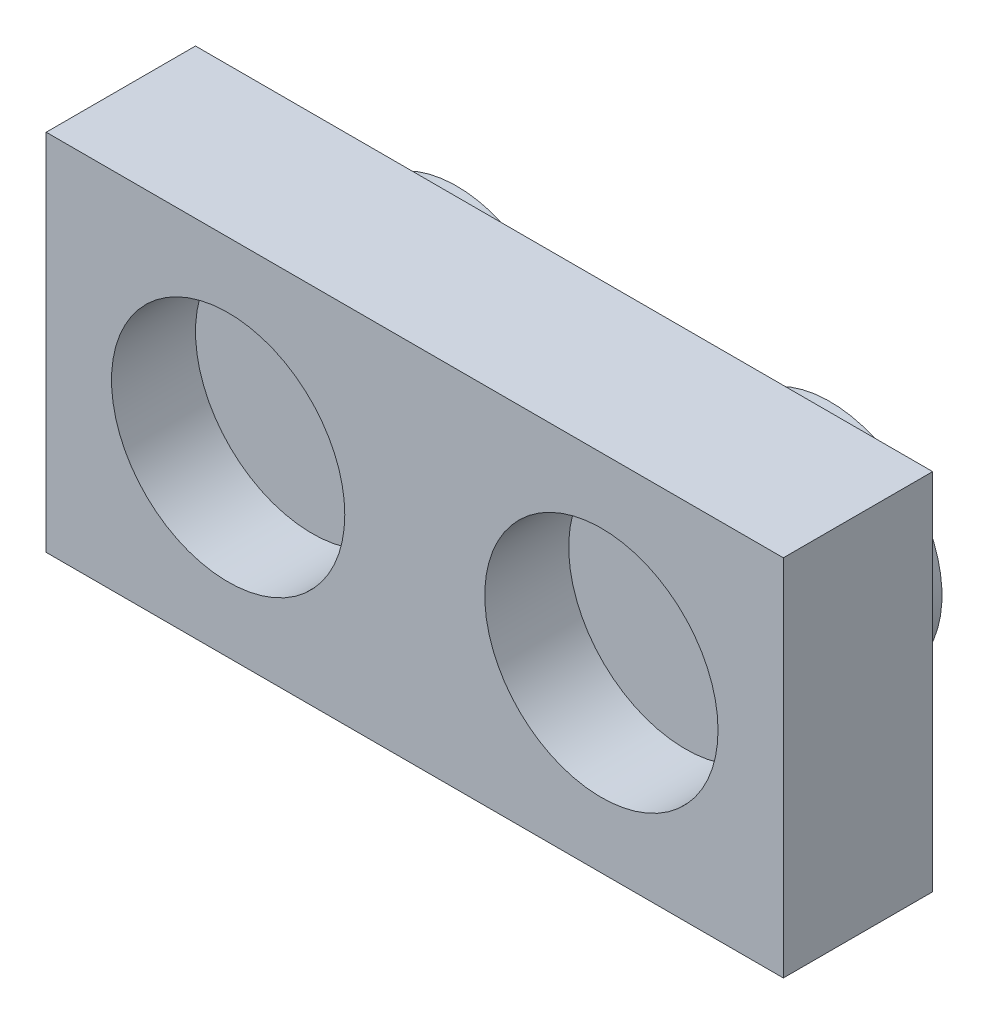
ISO-10303-21;
HEADER;
FILE_DESCRIPTION(('STEP AP214'),'2;1');
FILE_NAME('part.step','',(''),(''),'','','');
FILE_SCHEMA(('AUTOMOTIVE_DESIGN { 1 0 10303 214 1 1 1 1 }'));
ENDSEC;
DATA;
#1=APPLICATION_CONTEXT('core data for automotive mechanical design processes');
#2=APPLICATION_PROTOCOL_DEFINITION('international standard','automotive_design',2000,#1);
#3=PRODUCT_CONTEXT('',#1,'mechanical');
#4=PRODUCT('Part','Part','',(#3));
#5=PRODUCT_RELATED_PRODUCT_CATEGORY('part','',(#4));
#6=PRODUCT_DEFINITION_FORMATION('','',#4);
#7=PRODUCT_DEFINITION_CONTEXT('part definition',#1,'design');
#8=PRODUCT_DEFINITION('design','',#6,#7);
#9=PRODUCT_DEFINITION_SHAPE('','',#8);
#10=(LENGTH_UNIT() NAMED_UNIT(*) SI_UNIT(.MILLI.,.METRE.));
#11=(NAMED_UNIT(*) PLANE_ANGLE_UNIT() SI_UNIT($,.RADIAN.));
#12=(NAMED_UNIT(*) SI_UNIT($,.STERADIAN.) SOLID_ANGLE_UNIT());
#13=UNCERTAINTY_MEASURE_WITH_UNIT(LENGTH_MEASURE(1.E-05),#10,'distance_accuracy_value','');
#14=(GEOMETRIC_REPRESENTATION_CONTEXT(3) GLOBAL_UNCERTAINTY_ASSIGNED_CONTEXT((#13)) GLOBAL_UNIT_ASSIGNED_CONTEXT((#10,
#11,#12)) REPRESENTATION_CONTEXT('',''));
#15=CARTESIAN_POINT('',(0.,0.,0.));
#16=DIRECTION('',(0.,0.,1.));
#17=DIRECTION('',(1.,0.,0.));
#18=AXIS2_PLACEMENT_3D('',#15,#16,#17);
#19=CARTESIAN_POINT('',(7.9,-3.9,3.2));
#20=DIRECTION('',(-1.,0.,0.));
#21=DIRECTION('',(0.,0.,1.));
#22=AXIS2_PLACEMENT_3D('',#19,#20,#21);
#23=PLANE('',#22);
#24=DIRECTION('',(0.,1.,0.));
#25=VECTOR('',#24,1.);
#26=CARTESIAN_POINT('',(7.9,-3.9,0.));
#27=LINE('',#26,#25);
#28=CARTESIAN_POINT('',(7.9,-3.9,0.));
#29=VERTEX_POINT('',#28);
#30=CARTESIAN_POINT('',(7.9,3.9,0.));
#31=VERTEX_POINT('',#30);
#32=EDGE_CURVE('E98',#29,#31,#27,.T.);
#33=ORIENTED_EDGE('',*,*,#32,.T.);
#34=DIRECTION('',(0.,0.,-1.));
#35=VECTOR('',#34,1.);
#36=CARTESIAN_POINT('',(7.9,3.9,3.2));
#37=LINE('',#36,#35);
#38=CARTESIAN_POINT('',(7.9,3.9,3.2));
#39=VERTEX_POINT('',#38);
#40=EDGE_CURVE('E11',#39,#31,#37,.T.);
#41=ORIENTED_EDGE('',*,*,#40,.F.);
#42=DIRECTION('',(0.,1.,0.));
#43=VECTOR('',#42,1.);
#44=CARTESIAN_POINT('',(7.9,-3.9,3.2));
#45=LINE('',#44,#43);
#46=CARTESIAN_POINT('',(7.9,-3.9,3.2));
#47=VERTEX_POINT('',#46);
#48=EDGE_CURVE('E86',#47,#39,#45,.T.);
#49=ORIENTED_EDGE('',*,*,#48,.F.);
#50=DIRECTION('',(0.,0.,-1.));
#51=VECTOR('',#50,1.);
#52=CARTESIAN_POINT('',(7.9,-3.9,3.2));
#53=LINE('',#52,#51);
#54=EDGE_CURVE('E94',#47,#29,#53,.T.);
#55=ORIENTED_EDGE('',*,*,#54,.T.);
#56=EDGE_LOOP('',(#33,#41,#49,#55));
#57=FACE_BOUND('',#56,.T.);
#58=ADVANCED_FACE('F35',(#57),#23,.F.);
#59=CARTESIAN_POINT('',(-7.9,3.9,3.2));
#60=DIRECTION('',(0.,-1.,0.));
#61=DIRECTION('',(0.,0.,-1.));
#62=AXIS2_PLACEMENT_3D('',#59,#60,#61);
#63=PLANE('',#62);
#64=DIRECTION('',(-1.,0.,0.));
#65=VECTOR('',#64,1.);
#66=CARTESIAN_POINT('',(-7.9,3.9,0.));
#67=LINE('',#66,#65);
#68=CARTESIAN_POINT('',(-7.9,3.9,0.));
#69=VERTEX_POINT('',#68);
#70=EDGE_CURVE('E90',#31,#69,#67,.T.);
#71=ORIENTED_EDGE('',*,*,#70,.T.);
#72=DIRECTION('',(0.,0.,-1.));
#73=VECTOR('',#72,1.);
#74=CARTESIAN_POINT('',(-7.9,3.9,3.2));
#75=LINE('',#74,#73);
#76=CARTESIAN_POINT('',(-7.9,3.9,3.2));
#77=VERTEX_POINT('',#76);
#78=EDGE_CURVE('E43',#77,#69,#75,.T.);
#79=ORIENTED_EDGE('',*,*,#78,.F.);
#80=DIRECTION('',(-1.,0.,0.));
#81=VECTOR('',#80,1.);
#82=CARTESIAN_POINT('',(-7.9,3.9,3.2));
#83=LINE('',#82,#81);
#84=EDGE_CURVE('E81',#39,#77,#83,.T.);
#85=ORIENTED_EDGE('',*,*,#84,.F.);
#86=ORIENTED_EDGE('',*,*,#40,.T.);
#87=EDGE_LOOP('',(#71,#79,#85,#86));
#88=FACE_BOUND('',#87,.T.);
#89=ADVANCED_FACE('F89',(#88),#63,.F.);
#90=CARTESIAN_POINT('',(-7.9,-3.9,3.2));
#91=DIRECTION('',(1.,0.,0.));
#92=DIRECTION('',(0.,0.,-1.));
#93=AXIS2_PLACEMENT_3D('',#90,#91,#92);
#94=PLANE('',#93);
#95=DIRECTION('',(0.,-1.,0.));
#96=VECTOR('',#95,1.);
#97=CARTESIAN_POINT('',(-7.9,-3.9,0.));
#98=LINE('',#97,#96);
#99=CARTESIAN_POINT('',(-7.9,-3.9,0.));
#100=VERTEX_POINT('',#99);
#101=EDGE_CURVE('E68',#69,#100,#98,.T.);
#102=ORIENTED_EDGE('',*,*,#101,.T.);
#103=DIRECTION('',(0.,0.,-1.));
#104=VECTOR('',#103,1.);
#105=CARTESIAN_POINT('',(-7.9,-3.9,3.2));
#106=LINE('',#105,#104);
#107=CARTESIAN_POINT('',(-7.9,-3.9,3.2));
#108=VERTEX_POINT('',#107);
#109=EDGE_CURVE('E91',#108,#100,#106,.T.);
#110=ORIENTED_EDGE('',*,*,#109,.F.);
#111=DIRECTION('',(0.,-1.,0.));
#112=VECTOR('',#111,1.);
#113=CARTESIAN_POINT('',(-7.9,-3.9,3.2));
#114=LINE('',#113,#112);
#115=EDGE_CURVE('E84',#77,#108,#114,.T.);
#116=ORIENTED_EDGE('',*,*,#115,.F.);
#117=ORIENTED_EDGE('',*,*,#78,.T.);
#118=EDGE_LOOP('',(#102,#110,#116,#117));
#119=FACE_BOUND('',#118,.T.);
#120=ADVANCED_FACE('F92',(#119),#94,.F.);
#121=CARTESIAN_POINT('',(-7.9,-3.9,3.2));
#122=DIRECTION('',(0.,1.,0.));
#123=DIRECTION('',(0.,0.,1.));
#124=AXIS2_PLACEMENT_3D('',#121,#122,#123);
#125=PLANE('',#124);
#126=DIRECTION('',(1.,0.,0.));
#127=VECTOR('',#126,1.);
#128=CARTESIAN_POINT('',(-7.9,-3.9,0.));
#129=LINE('',#128,#127);
#130=EDGE_CURVE('E74',#100,#29,#129,.T.);
#131=ORIENTED_EDGE('',*,*,#130,.T.);
#132=ORIENTED_EDGE('',*,*,#54,.F.);
#133=DIRECTION('',(1.,0.,0.));
#134=VECTOR('',#133,1.);
#135=CARTESIAN_POINT('',(-7.9,-3.9,3.2));
#136=LINE('',#135,#134);
#137=EDGE_CURVE('E51',#108,#47,#136,.T.);
#138=ORIENTED_EDGE('',*,*,#137,.F.);
#139=ORIENTED_EDGE('',*,*,#109,.T.);
#140=EDGE_LOOP('',(#131,#132,#138,#139));
#141=FACE_BOUND('',#140,.T.);
#142=ADVANCED_FACE('F106',(#141),#125,.F.);
#143=CARTESIAN_POINT('',(0.,0.,3.2));
#144=DIRECTION('',(0.,0.,-1.));
#145=DIRECTION('',(-1.,0.,0.));
#146=AXIS2_PLACEMENT_3D('',#143,#144,#145);
#147=PLANE('',#146);
#148=CARTESIAN_POINT('',(-4.,0.,3.2));
#149=DIRECTION('',(0.,0.,1.));
#150=DIRECTION('',(1.,0.,0.));
#151=AXIS2_PLACEMENT_3D('',#148,#149,#150);
#152=CIRCLE('',#151,2.5);
#153=CARTESIAN_POINT('',(-1.5,0.,3.2));
#154=VERTEX_POINT('',#153);
#155=EDGE_CURVE('E130',#154,#154,#152,.T.);
#156=ORIENTED_EDGE('',*,*,#155,.F.);
#157=EDGE_LOOP('',(#156));
#158=FACE_BOUND('',#157,.T.);
#159=CARTESIAN_POINT('',(4.,0.,3.2));
#160=DIRECTION('',(0.,0.,1.));
#161=DIRECTION('',(1.,0.,0.));
#162=AXIS2_PLACEMENT_3D('',#159,#160,#161);
#163=CIRCLE('',#162,2.5);
#164=CARTESIAN_POINT('',(6.5,0.,3.2));
#165=VERTEX_POINT('',#164);
#166=EDGE_CURVE('E124',#165,#165,#163,.T.);
#167=ORIENTED_EDGE('',*,*,#166,.F.);
#168=EDGE_LOOP('',(#167));
#169=FACE_BOUND('',#168,.T.);
#170=ORIENTED_EDGE('',*,*,#48,.T.);
#171=ORIENTED_EDGE('',*,*,#84,.T.);
#172=ORIENTED_EDGE('',*,*,#115,.T.);
#173=ORIENTED_EDGE('',*,*,#137,.T.);
#174=EDGE_LOOP('',(#170,#171,#172,#173));
#175=FACE_BOUND('',#174,.T.);
#176=ADVANCED_FACE('F82',(#158,#169,#175),#147,.F.);
#177=CARTESIAN_POINT('',(0.,0.,0.));
#178=DIRECTION('',(0.,0.,-1.));
#179=DIRECTION('',(-1.,0.,0.));
#180=AXIS2_PLACEMENT_3D('',#177,#178,#179);
#181=PLANE('',#180);
#182=CARTESIAN_POINT('',(-4.,0.,0.));
#183=DIRECTION('',(0.,0.,-1.));
#184=DIRECTION('',(-1.,0.,0.));
#185=AXIS2_PLACEMENT_3D('',#182,#183,#184);
#186=CIRCLE('',#185,2.4);
#187=CARTESIAN_POINT('',(-6.4,0.,0.));
#188=VERTEX_POINT('',#187);
#189=EDGE_CURVE('E118',#188,#188,#186,.T.);
#190=ORIENTED_EDGE('',*,*,#189,.F.);
#191=EDGE_LOOP('',(#190));
#192=FACE_BOUND('',#191,.T.);
#193=CARTESIAN_POINT('',(4.,0.,0.));
#194=DIRECTION('',(0.,0.,-1.));
#195=DIRECTION('',(-1.,0.,0.));
#196=AXIS2_PLACEMENT_3D('',#193,#194,#195);
#197=CIRCLE('',#196,2.4);
#198=CARTESIAN_POINT('',(1.6,0.,0.));
#199=VERTEX_POINT('',#198);
#200=EDGE_CURVE('E112',#199,#199,#197,.T.);
#201=ORIENTED_EDGE('',*,*,#200,.F.);
#202=EDGE_LOOP('',(#201));
#203=FACE_BOUND('',#202,.T.);
#204=ORIENTED_EDGE('',*,*,#32,.F.);
#205=ORIENTED_EDGE('',*,*,#130,.F.);
#206=ORIENTED_EDGE('',*,*,#101,.F.);
#207=ORIENTED_EDGE('',*,*,#70,.F.);
#208=EDGE_LOOP('',(#204,#205,#206,#207));
#209=FACE_BOUND('',#208,.T.);
#210=ADVANCED_FACE('F109',(#192,#203,#209),#181,.T.);
#211=CARTESIAN_POINT('',(4.,0.,-1.7));
#212=DIRECTION('',(0.,0.,1.));
#213=DIRECTION('',(1.,0.,0.));
#214=AXIS2_PLACEMENT_3D('',#211,#212,#213);
#215=CYLINDRICAL_SURFACE('',#214,2.4);
#216=CARTESIAN_POINT('',(4.,0.,-1.7));
#217=DIRECTION('',(0.,0.,-1.));
#218=DIRECTION('',(-1.,0.,0.));
#219=AXIS2_PLACEMENT_3D('',#216,#217,#218);
#220=CIRCLE('',#219,2.4);
#221=CARTESIAN_POINT('',(1.6,0.,-1.7));
#222=VERTEX_POINT('',#221);
#223=EDGE_CURVE('E101',#222,#222,#220,.T.);
#224=ORIENTED_EDGE('',*,*,#223,.F.);
#225=EDGE_LOOP('',(#224));
#226=FACE_BOUND('',#225,.T.);
#227=ORIENTED_EDGE('',*,*,#200,.T.);
#228=EDGE_LOOP('',(#227));
#229=FACE_BOUND('',#228,.T.);
#230=ADVANCED_FACE('F177',(#226,#229),#215,.T.);
#231=CARTESIAN_POINT('',(4.,0.,-1.7));
#232=DIRECTION('',(0.,0.,-1.));
#233=DIRECTION('',(-1.,0.,0.));
#234=AXIS2_PLACEMENT_3D('',#231,#232,#233);
#235=PLANE('',#234);
#236=ORIENTED_EDGE('',*,*,#223,.T.);
#237=EDGE_LOOP('',(#236));
#238=FACE_BOUND('',#237,.T.);
#239=ADVANCED_FACE('F182',(#238),#235,.T.);
#240=CARTESIAN_POINT('',(-4.,0.,-1.7));
#241=DIRECTION('',(0.,0.,1.));
#242=DIRECTION('',(1.,0.,0.));
#243=AXIS2_PLACEMENT_3D('',#240,#241,#242);
#244=CYLINDRICAL_SURFACE('',#243,2.4);
#245=CARTESIAN_POINT('',(-4.,0.,-1.7));
#246=DIRECTION('',(0.,0.,-1.));
#247=DIRECTION('',(-1.,0.,0.));
#248=AXIS2_PLACEMENT_3D('',#245,#246,#247);
#249=CIRCLE('',#248,2.4);
#250=CARTESIAN_POINT('',(-6.4,0.,-1.7));
#251=VERTEX_POINT('',#250);
#252=EDGE_CURVE('E115',#251,#251,#249,.T.);
#253=ORIENTED_EDGE('',*,*,#252,.F.);
#254=EDGE_LOOP('',(#253));
#255=FACE_BOUND('',#254,.T.);
#256=ORIENTED_EDGE('',*,*,#189,.T.);
#257=EDGE_LOOP('',(#256));
#258=FACE_BOUND('',#257,.T.);
#259=ADVANCED_FACE('F161',(#255,#258),#244,.T.);
#260=CARTESIAN_POINT('',(-4.,0.,-1.7));
#261=DIRECTION('',(0.,0.,-1.));
#262=DIRECTION('',(-1.,0.,0.));
#263=AXIS2_PLACEMENT_3D('',#260,#261,#262);
#264=PLANE('',#263);
#265=ORIENTED_EDGE('',*,*,#252,.T.);
#266=EDGE_LOOP('',(#265));
#267=FACE_BOUND('',#266,.T.);
#268=ADVANCED_FACE('F152',(#267),#264,.T.);
#269=CARTESIAN_POINT('',(4.,0.,1.4));
#270=DIRECTION('',(0.,0.,1.));
#271=DIRECTION('',(1.,0.,0.));
#272=AXIS2_PLACEMENT_3D('',#269,#270,#271);
#273=CYLINDRICAL_SURFACE('',#272,2.5);
#274=CARTESIAN_POINT('',(4.,0.,1.4));
#275=DIRECTION('',(0.,0.,1.));
#276=DIRECTION('',(1.,0.,0.));
#277=AXIS2_PLACEMENT_3D('',#274,#275,#276);
#278=CIRCLE('',#277,2.5);
#279=CARTESIAN_POINT('',(6.5,0.,1.4));
#280=VERTEX_POINT('',#279);
#281=EDGE_CURVE('E127',#280,#280,#278,.T.);
#282=ORIENTED_EDGE('',*,*,#281,.F.);
#283=EDGE_LOOP('',(#282));
#284=FACE_BOUND('',#283,.T.);
#285=ORIENTED_EDGE('',*,*,#166,.T.);
#286=EDGE_LOOP('',(#285));
#287=FACE_BOUND('',#286,.T.);
#288=ADVANCED_FACE('F150',(#284,#287),#273,.F.);
#289=CARTESIAN_POINT('',(4.,0.,1.4));
#290=DIRECTION('',(0.,0.,1.));
#291=DIRECTION('',(1.,0.,0.));
#292=AXIS2_PLACEMENT_3D('',#289,#290,#291);
#293=PLANE('',#292);
#294=ORIENTED_EDGE('',*,*,#281,.T.);
#295=EDGE_LOOP('',(#294));
#296=FACE_BOUND('',#295,.T.);
#297=ADVANCED_FACE('F141',(#296),#293,.T.);
#298=CARTESIAN_POINT('',(-4.,0.,1.4));
#299=DIRECTION('',(0.,0.,1.));
#300=DIRECTION('',(1.,0.,0.));
#301=AXIS2_PLACEMENT_3D('',#298,#299,#300);
#302=CYLINDRICAL_SURFACE('',#301,2.5);
#303=CARTESIAN_POINT('',(-4.,0.,1.4));
#304=DIRECTION('',(0.,0.,1.));
#305=DIRECTION('',(1.,0.,0.));
#306=AXIS2_PLACEMENT_3D('',#303,#304,#305);
#307=CIRCLE('',#306,2.5);
#308=CARTESIAN_POINT('',(-1.5,0.,1.4));
#309=VERTEX_POINT('',#308);
#310=EDGE_CURVE('E121',#309,#309,#307,.T.);
#311=ORIENTED_EDGE('',*,*,#310,.F.);
#312=EDGE_LOOP('',(#311));
#313=FACE_BOUND('',#312,.T.);
#314=ORIENTED_EDGE('',*,*,#155,.T.);
#315=EDGE_LOOP('',(#314));
#316=FACE_BOUND('',#315,.T.);
#317=ADVANCED_FACE('F138',(#313,#316),#302,.F.);
#318=CARTESIAN_POINT('',(-4.,0.,1.4));
#319=DIRECTION('',(0.,0.,1.));
#320=DIRECTION('',(1.,0.,0.));
#321=AXIS2_PLACEMENT_3D('',#318,#319,#320);
#322=PLANE('',#321);
#323=ORIENTED_EDGE('',*,*,#310,.T.);
#324=EDGE_LOOP('',(#323));
#325=FACE_BOUND('',#324,.T.);
#326=ADVANCED_FACE('F136',(#325),#322,.T.);
#327=CLOSED_SHELL('',(#58,#89,#120,#142,#176,#210,#230,#239,#259,#268,#288,#297,#317,#326));
#328=MANIFOLD_SOLID_BREP('B2',#327);
#329=ADVANCED_BREP_SHAPE_REPRESENTATION('',(#18,#328),#14);
#330=SHAPE_DEFINITION_REPRESENTATION(#9,#329);
ENDSEC;
END-ISO-10303-21;
